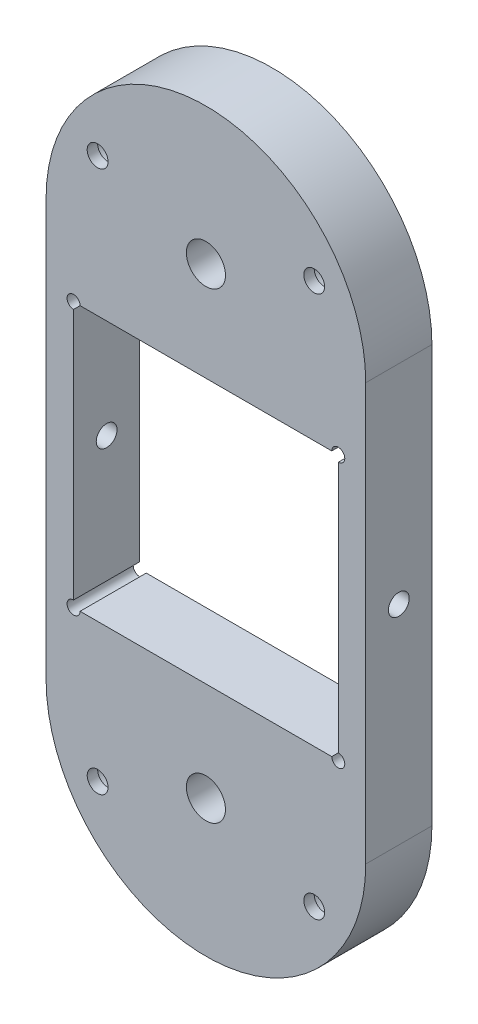
ISO-10303-21;
HEADER;
FILE_DESCRIPTION(('STEP AP214'),'2;1');
FILE_NAME('part.step','',(''),(''),'','','');
FILE_SCHEMA(('AUTOMOTIVE_DESIGN { 1 0 10303 214 1 1 1 1 }'));
ENDSEC;
DATA;
#1=APPLICATION_CONTEXT('core data for automotive mechanical design processes');
#2=APPLICATION_PROTOCOL_DEFINITION('international standard','automotive_design',2000,#1);
#3=PRODUCT_CONTEXT('',#1,'mechanical');
#4=PRODUCT('Part','Part','',(#3));
#5=PRODUCT_RELATED_PRODUCT_CATEGORY('part','',(#4));
#6=PRODUCT_DEFINITION_FORMATION('','',#4);
#7=PRODUCT_DEFINITION_CONTEXT('part definition',#1,'design');
#8=PRODUCT_DEFINITION('design','',#6,#7);
#9=PRODUCT_DEFINITION_SHAPE('','',#8);
#10=(LENGTH_UNIT() NAMED_UNIT(*) SI_UNIT(.MILLI.,.METRE.));
#11=(NAMED_UNIT(*) PLANE_ANGLE_UNIT() SI_UNIT($,.RADIAN.));
#12=(NAMED_UNIT(*) SI_UNIT($,.STERADIAN.) SOLID_ANGLE_UNIT());
#13=UNCERTAINTY_MEASURE_WITH_UNIT(LENGTH_MEASURE(1.E-05),#10,'distance_accuracy_value','');
#14=(GEOMETRIC_REPRESENTATION_CONTEXT(3) GLOBAL_UNCERTAINTY_ASSIGNED_CONTEXT((#13)) GLOBAL_UNIT_ASSIGNED_CONTEXT((#10,
#11,#12)) REPRESENTATION_CONTEXT('',''));
#15=CARTESIAN_POINT('',(0.,0.,0.));
#16=DIRECTION('',(0.,0.,1.));
#17=DIRECTION('',(1.,0.,0.));
#18=AXIS2_PLACEMENT_3D('',#15,#16,#17);
#19=CARTESIAN_POINT('',(0.,44.4,-71.8420489685532));
#20=DIRECTION('',(0.,0.,1.));
#21=DIRECTION('',(1.,0.,0.));
#22=AXIS2_PLACEMENT_3D('',#19,#20,#21);
#23=CYLINDRICAL_SURFACE('',#22,2.5);
#24=CARTESIAN_POINT('',(0.,44.4,0.));
#25=DIRECTION('',(0.,0.,1.));
#26=DIRECTION('',(1.,0.,0.));
#27=AXIS2_PLACEMENT_3D('',#24,#25,#26);
#28=CIRCLE('',#27,2.5);
#29=CARTESIAN_POINT('',(2.5,44.4,0.));
#30=VERTEX_POINT('',#29);
#31=EDGE_CURVE('E361',#30,#30,#28,.F.);
#32=CARTESIAN_POINT('',(0.,44.4,2.));
#33=DIRECTION('',(0.,0.,1.));
#34=DIRECTION('',(1.,0.,0.));
#35=AXIS2_PLACEMENT_3D('',#32,#33,#34);
#36=CIRCLE('',#35,2.5);
#37=CARTESIAN_POINT('',(2.5,44.4,1.99999999999999));
#38=VERTEX_POINT('',#37);
#39=EDGE_CURVE('E51',#38,#38,#36,.F.);
#40=CARTESIAN_POINT('',(2.5,44.4,0.));
#41=CARTESIAN_POINT('',(2.5,44.4,0.0208333333333172));
#42=CARTESIAN_POINT('',(2.5,44.4,0.0416666666666482));
#43=CARTESIAN_POINT('',(2.5,44.4,0.0833333333333149));
#44=CARTESIAN_POINT('',(2.5,44.4,0.104166666666651));
#45=CARTESIAN_POINT('',(2.5,44.4,0.145833333333322));
#46=CARTESIAN_POINT('',(2.5,44.4,0.166666666666658));
#47=CARTESIAN_POINT('',(2.5,44.4,0.208333333333324));
#48=CARTESIAN_POINT('',(2.5,44.4,0.229166666666655));
#49=CARTESIAN_POINT('',(2.5,44.4,0.270833333333317));
#50=CARTESIAN_POINT('',(2.5,44.4,0.291666666666648));
#51=CARTESIAN_POINT('',(2.5,44.4,0.333333333333315));
#52=CARTESIAN_POINT('',(2.5,44.4,0.354166666666651));
#53=CARTESIAN_POINT('',(2.5,44.4,0.395833333333322));
#54=CARTESIAN_POINT('',(2.5,44.4,0.416666666666658));
#55=CARTESIAN_POINT('',(2.5,44.4,0.458333333333324));
#56=CARTESIAN_POINT('',(2.5,44.4,0.479166666666656));
#57=CARTESIAN_POINT('',(2.5,44.4,0.520833333333318));
#58=CARTESIAN_POINT('',(2.5,44.4,0.541666666666649));
#59=CARTESIAN_POINT('',(2.5,44.4,0.583333333333315));
#60=CARTESIAN_POINT('',(2.5,44.4,0.604166666666651));
#61=CARTESIAN_POINT('',(2.5,44.4,0.645833333333322));
#62=CARTESIAN_POINT('',(2.5,44.4,0.666666666666658));
#63=CARTESIAN_POINT('',(2.5,44.4,0.708333333333325));
#64=CARTESIAN_POINT('',(2.5,44.4,0.729166666666656));
#65=CARTESIAN_POINT('',(2.5,44.4,0.770833333333318));
#66=CARTESIAN_POINT('',(2.5,44.4,0.791666666666649));
#67=CARTESIAN_POINT('',(2.5,44.4,0.833333333333316));
#68=CARTESIAN_POINT('',(2.5,44.4,0.854166666666651));
#69=CARTESIAN_POINT('',(2.5,44.4,0.895833333333323));
#70=CARTESIAN_POINT('',(2.5,44.4,0.916666666666658));
#71=CARTESIAN_POINT('',(2.5,44.4,0.958333333333325));
#72=CARTESIAN_POINT('',(2.5,44.4,0.979166666666656));
#73=CARTESIAN_POINT('',(2.5,44.4,1.02083333333332));
#74=CARTESIAN_POINT('',(2.5,44.4,1.04166666666665));
#75=CARTESIAN_POINT('',(2.5,44.4,1.08333333333332));
#76=CARTESIAN_POINT('',(2.5,44.4,1.10416666666665));
#77=CARTESIAN_POINT('',(2.5,44.4,1.14583333333332));
#78=CARTESIAN_POINT('',(2.5,44.4,1.16666666666666));
#79=CARTESIAN_POINT('',(2.5,44.4,1.20833333333333));
#80=CARTESIAN_POINT('',(2.5,44.4,1.22916666666666));
#81=CARTESIAN_POINT('',(2.5,44.4,1.27083333333332));
#82=CARTESIAN_POINT('',(2.5,44.4,1.29166666666665));
#83=CARTESIAN_POINT('',(2.5,44.4,1.33333333333332));
#84=CARTESIAN_POINT('',(2.5,44.4,1.35416666666665));
#85=CARTESIAN_POINT('',(2.5,44.4,1.39583333333332));
#86=CARTESIAN_POINT('',(2.5,44.4,1.41666666666666));
#87=CARTESIAN_POINT('',(2.5,44.4,1.45833333333333));
#88=CARTESIAN_POINT('',(2.5,44.4,1.47916666666666));
#89=CARTESIAN_POINT('',(2.5,44.4,1.52083333333332));
#90=CARTESIAN_POINT('',(2.5,44.4,1.54166666666665));
#91=CARTESIAN_POINT('',(2.5,44.4,1.58333333333332));
#92=CARTESIAN_POINT('',(2.5,44.4,1.60416666666665));
#93=CARTESIAN_POINT('',(2.5,44.4,1.64583333333332));
#94=CARTESIAN_POINT('',(2.5,44.4,1.66666666666666));
#95=CARTESIAN_POINT('',(2.5,44.4,1.70833333333333));
#96=CARTESIAN_POINT('',(2.5,44.4,1.72916666666666));
#97=CARTESIAN_POINT('',(2.5,44.4,1.77083333333332));
#98=CARTESIAN_POINT('',(2.5,44.4,1.79166666666665));
#99=CARTESIAN_POINT('',(2.5,44.4,1.83333333333332));
#100=CARTESIAN_POINT('',(2.5,44.4,1.85416666666665));
#101=CARTESIAN_POINT('',(2.5,44.4,1.89583333333332));
#102=CARTESIAN_POINT('',(2.5,44.4,1.91666666666666));
#103=CARTESIAN_POINT('',(2.5,44.4,1.95833333333333));
#104=CARTESIAN_POINT('',(2.5,44.4,1.97916666666666));
#105=CARTESIAN_POINT('',(2.5,44.4,1.99999999999999));
#106=B_SPLINE_CURVE_WITH_KNOTS('',3,(#40,#41,#42,#43,#44,#45,#46,#47,#48,#49,#50,#51,#52,#53,
#54,#55,#56,#57,#58,#59,#60,#61,#62,#63,#64,#65,#66,#67,#68,#69,#70,#71,#72,#73,#74,#75,#76,#77,
#78,#79,#80,#81,#82,#83,#84,#85,#86,#87,#88,#89,#90,#91,#92,#93,#94,#95,#96,#97,#98,#99,#100,
#101,#102,#103,#104,#105),.UNSPECIFIED.,.F.,.F.,(4,2,2,2,2,2,2,2,2,2,2,2,2,2,2,2,2,2,2,2,2,2,2,
2,2,2,2,2,2,2,2,2,4),(0.,0.0624999999999931,0.125,0.187500000000007,0.25,0.312499999999993,
0.375,0.437500000000007,0.5,0.562499999999994,0.625000000000001,0.687500000000008,
0.750000000000001,0.812499999999994,0.875000000000001,0.937500000000008,1.,1.06249999999999,
1.125,1.18750000000001,1.25,1.31249999999999,1.375,1.43750000000001,1.5,1.56249999999999,1.625,
1.68750000000001,1.75,1.81249999999999,1.875,1.93750000000001,2.),.UNSPECIFIED.);
#107=EDGE_CURVE('BSEAM47',#30,#38,#106,.T.);
#108=ORIENTED_EDGE('',*,*,#31,.T.);
#109=ORIENTED_EDGE('',*,*,#39,.F.);
#110=ORIENTED_EDGE('',*,*,#107,.T.);
#111=ORIENTED_EDGE('',*,*,#107,.F.);
#112=EDGE_LOOP('',(#108,#110,#109,#111));
#113=FACE_BOUND('',#112,.T.);
#114=ADVANCED_FACE('F47',(#113),#23,.F.);
#115=CARTESIAN_POINT('',(0.,-44.4,-71.8420489685532));
#116=DIRECTION('',(0.,0.,1.));
#117=DIRECTION('',(1.,0.,0.));
#118=AXIS2_PLACEMENT_3D('',#115,#116,#117);
#119=CYLINDRICAL_SURFACE('',#118,2.49999999999999);
#120=CARTESIAN_POINT('',(0.,-44.4,0.));
#121=DIRECTION('',(0.,0.,1.));
#122=DIRECTION('',(1.,0.,0.));
#123=AXIS2_PLACEMENT_3D('',#120,#121,#122);
#124=CIRCLE('',#123,2.49999999999999);
#125=CARTESIAN_POINT('',(2.49999999999997,-44.4,0.));
#126=VERTEX_POINT('',#125);
#127=EDGE_CURVE('E360',#126,#126,#124,.F.);
#128=CARTESIAN_POINT('',(0.,-44.4,2.));
#129=DIRECTION('',(0.,0.,1.));
#130=DIRECTION('',(1.,0.,0.));
#131=AXIS2_PLACEMENT_3D('',#128,#129,#130);
#132=CIRCLE('',#131,2.49999999999999);
#133=CARTESIAN_POINT('',(2.49999999999997,-44.4,1.99999999999999));
#134=VERTEX_POINT('',#133);
#135=EDGE_CURVE('E270',#134,#134,#132,.F.);
#136=CARTESIAN_POINT('',(2.49999999999997,-44.4,0.));
#137=CARTESIAN_POINT('',(2.49999999999997,-44.4,0.0208333333333172));
#138=CARTESIAN_POINT('',(2.49999999999997,-44.4,0.0416666666666482));
#139=CARTESIAN_POINT('',(2.49999999999997,-44.4,0.0833333333333149));
#140=CARTESIAN_POINT('',(2.49999999999997,-44.4,0.104166666666651));
#141=CARTESIAN_POINT('',(2.49999999999997,-44.4,0.145833333333322));
#142=CARTESIAN_POINT('',(2.49999999999997,-44.4,0.166666666666658));
#143=CARTESIAN_POINT('',(2.49999999999997,-44.4,0.208333333333324));
#144=CARTESIAN_POINT('',(2.49999999999997,-44.4,0.229166666666655));
#145=CARTESIAN_POINT('',(2.49999999999997,-44.4,0.270833333333317));
#146=CARTESIAN_POINT('',(2.49999999999997,-44.4,0.291666666666648));
#147=CARTESIAN_POINT('',(2.49999999999997,-44.4,0.333333333333315));
#148=CARTESIAN_POINT('',(2.49999999999997,-44.4,0.354166666666651));
#149=CARTESIAN_POINT('',(2.49999999999997,-44.4,0.395833333333322));
#150=CARTESIAN_POINT('',(2.49999999999997,-44.4,0.416666666666658));
#151=CARTESIAN_POINT('',(2.49999999999997,-44.4,0.458333333333324));
#152=CARTESIAN_POINT('',(2.49999999999997,-44.4,0.479166666666656));
#153=CARTESIAN_POINT('',(2.49999999999997,-44.4,0.520833333333318));
#154=CARTESIAN_POINT('',(2.49999999999997,-44.4,0.541666666666649));
#155=CARTESIAN_POINT('',(2.49999999999997,-44.4,0.583333333333315));
#156=CARTESIAN_POINT('',(2.49999999999997,-44.4,0.604166666666651));
#157=CARTESIAN_POINT('',(2.49999999999997,-44.4,0.645833333333322));
#158=CARTESIAN_POINT('',(2.49999999999997,-44.4,0.666666666666658));
#159=CARTESIAN_POINT('',(2.49999999999997,-44.4,0.708333333333325));
#160=CARTESIAN_POINT('',(2.49999999999997,-44.4,0.729166666666656));
#161=CARTESIAN_POINT('',(2.49999999999997,-44.4,0.770833333333318));
#162=CARTESIAN_POINT('',(2.49999999999997,-44.4,0.791666666666649));
#163=CARTESIAN_POINT('',(2.49999999999997,-44.4,0.833333333333316));
#164=CARTESIAN_POINT('',(2.49999999999997,-44.4,0.854166666666651));
#165=CARTESIAN_POINT('',(2.49999999999997,-44.4,0.895833333333323));
#166=CARTESIAN_POINT('',(2.49999999999997,-44.4,0.916666666666658));
#167=CARTESIAN_POINT('',(2.49999999999997,-44.4,0.958333333333325));
#168=CARTESIAN_POINT('',(2.49999999999997,-44.4,0.979166666666656));
#169=CARTESIAN_POINT('',(2.49999999999997,-44.4,1.02083333333332));
#170=CARTESIAN_POINT('',(2.49999999999997,-44.4,1.04166666666665));
#171=CARTESIAN_POINT('',(2.49999999999997,-44.4,1.08333333333332));
#172=CARTESIAN_POINT('',(2.49999999999997,-44.4,1.10416666666665));
#173=CARTESIAN_POINT('',(2.49999999999997,-44.4,1.14583333333332));
#174=CARTESIAN_POINT('',(2.49999999999997,-44.4,1.16666666666666));
#175=CARTESIAN_POINT('',(2.49999999999997,-44.4,1.20833333333333));
#176=CARTESIAN_POINT('',(2.49999999999997,-44.4,1.22916666666666));
#177=CARTESIAN_POINT('',(2.49999999999997,-44.4,1.27083333333332));
#178=CARTESIAN_POINT('',(2.49999999999997,-44.4,1.29166666666665));
#179=CARTESIAN_POINT('',(2.49999999999997,-44.4,1.33333333333332));
#180=CARTESIAN_POINT('',(2.49999999999997,-44.4,1.35416666666665));
#181=CARTESIAN_POINT('',(2.49999999999997,-44.4,1.39583333333332));
#182=CARTESIAN_POINT('',(2.49999999999997,-44.4,1.41666666666666));
#183=CARTESIAN_POINT('',(2.49999999999997,-44.4,1.45833333333333));
#184=CARTESIAN_POINT('',(2.49999999999997,-44.4,1.47916666666666));
#185=CARTESIAN_POINT('',(2.49999999999997,-44.4,1.52083333333332));
#186=CARTESIAN_POINT('',(2.49999999999997,-44.4,1.54166666666665));
#187=CARTESIAN_POINT('',(2.49999999999997,-44.4,1.58333333333332));
#188=CARTESIAN_POINT('',(2.49999999999997,-44.4,1.60416666666665));
#189=CARTESIAN_POINT('',(2.49999999999997,-44.4,1.64583333333332));
#190=CARTESIAN_POINT('',(2.49999999999997,-44.4,1.66666666666666));
#191=CARTESIAN_POINT('',(2.49999999999997,-44.4,1.70833333333333));
#192=CARTESIAN_POINT('',(2.49999999999997,-44.4,1.72916666666666));
#193=CARTESIAN_POINT('',(2.49999999999997,-44.4,1.77083333333332));
#194=CARTESIAN_POINT('',(2.49999999999997,-44.4,1.79166666666665));
#195=CARTESIAN_POINT('',(2.49999999999997,-44.4,1.83333333333332));
#196=CARTESIAN_POINT('',(2.49999999999997,-44.4,1.85416666666665));
#197=CARTESIAN_POINT('',(2.49999999999997,-44.4,1.89583333333332));
#198=CARTESIAN_POINT('',(2.49999999999997,-44.4,1.91666666666666));
#199=CARTESIAN_POINT('',(2.49999999999997,-44.4,1.95833333333333));
#200=CARTESIAN_POINT('',(2.49999999999997,-44.4,1.97916666666666));
#201=CARTESIAN_POINT('',(2.49999999999997,-44.4,1.99999999999999));
#202=B_SPLINE_CURVE_WITH_KNOTS('',3,(#136,#137,#138,#139,#140,#141,#142,#143,#144,#145,#146,
#147,#148,#149,#150,#151,#152,#153,#154,#155,#156,#157,#158,#159,#160,#161,#162,#163,#164,#165,
#166,#167,#168,#169,#170,#171,#172,#173,#174,#175,#176,#177,#178,#179,#180,#181,#182,#183,#184,
#185,#186,#187,#188,#189,#190,#191,#192,#193,#194,#195,#196,#197,#198,#199,#200,#201),
.UNSPECIFIED.,.F.,.F.,(4,2,2,2,2,2,2,2,2,2,2,2,2,2,2,2,2,2,2,2,2,2,2,2,2,2,2,2,2,2,2,2,4),(0.,
0.0624999999999931,0.125,0.187500000000007,0.25,0.312499999999993,0.375,0.437500000000007,0.5,
0.562499999999994,0.625000000000001,0.687500000000008,0.750000000000001,0.812499999999994,
0.875000000000001,0.937500000000008,1.,1.06249999999999,1.125,1.18750000000001,1.25,
1.31249999999999,1.375,1.43750000000001,1.5,1.56249999999999,1.625,1.68750000000001,1.75,
1.81249999999999,1.875,1.93750000000001,2.),.UNSPECIFIED.);
#203=EDGE_CURVE('BSEAM416',#126,#134,#202,.T.);
#204=ORIENTED_EDGE('',*,*,#127,.T.);
#205=ORIENTED_EDGE('',*,*,#135,.F.);
#206=ORIENTED_EDGE('',*,*,#203,.T.);
#207=ORIENTED_EDGE('',*,*,#203,.F.);
#208=EDGE_LOOP('',(#204,#206,#205,#207));
#209=FACE_BOUND('',#208,.T.);
#210=ADVANCED_FACE('F416',(#209),#119,.F.);
#211=CARTESIAN_POINT('',(54.3249997674112,0.,6.35));
#212=DIRECTION('',(-1.,0.,0.));
#213=DIRECTION('',(0.,-1.,0.));
#214=AXIS2_PLACEMENT_3D('',#211,#212,#213);
#215=CYLINDRICAL_SURFACE('',#214,2.);
#216=CARTESIAN_POINT('',(25.4,0.,6.35));
#217=DIRECTION('',(1.,0.,0.));
#218=DIRECTION('',(0.,0.,-1.));
#219=AXIS2_PLACEMENT_3D('',#216,#217,#218);
#220=CIRCLE('',#219,2.);
#221=CARTESIAN_POINT('',(25.4,0.,4.35));
#222=VERTEX_POINT('',#221);
#223=EDGE_CURVE('E173',#222,#222,#220,.F.);
#224=ORIENTED_EDGE('',*,*,#223,.T.);
#225=EDGE_LOOP('',(#224));
#226=FACE_BOUND('',#225,.T.);
#227=CARTESIAN_POINT('',(30.6750002325889,0.,6.35));
#228=DIRECTION('',(-1.,0.,0.));
#229=DIRECTION('',(0.,0.,1.));
#230=AXIS2_PLACEMENT_3D('',#227,#228,#229);
#231=CIRCLE('',#230,2.);
#232=CARTESIAN_POINT('',(30.6750002325889,0.,8.35));
#233=VERTEX_POINT('',#232);
#234=EDGE_CURVE('E185',#233,#233,#231,.T.);
#235=ORIENTED_EDGE('',*,*,#234,.F.);
#236=EDGE_LOOP('',(#235));
#237=FACE_BOUND('',#236,.T.);
#238=ADVANCED_FACE('F423',(#226,#237),#215,.F.);
#239=CARTESIAN_POINT('',(0.,40.,12.7));
#240=DIRECTION('',(0.,0.,1.));
#241=DIRECTION('',(1.,0.,0.));
#242=AXIS2_PLACEMENT_3D('',#239,#240,#241);
#243=PLANE('',#242);
#244=CARTESIAN_POINT('',(0.,44.4,12.7));
#245=DIRECTION('',(0.,0.,1.));
#246=DIRECTION('',(1.,0.,0.));
#247=AXIS2_PLACEMENT_3D('',#244,#245,#246);
#248=CIRCLE('',#247,3.75);
#249=CARTESIAN_POINT('',(3.75,44.4,12.7));
#250=VERTEX_POINT('',#249);
#251=EDGE_CURVE('E281',#250,#250,#248,.T.);
#252=ORIENTED_EDGE('',*,*,#251,.F.);
#253=EDGE_LOOP('',(#252));
#254=FACE_BOUND('',#253,.T.);
#255=CARTESIAN_POINT('',(0.,-44.4,12.7));
#256=DIRECTION('',(0.,0.,1.));
#257=DIRECTION('',(-1.,0.,0.));
#258=AXIS2_PLACEMENT_3D('',#255,#256,#257);
#259=CIRCLE('',#258,3.74999999999999);
#260=CARTESIAN_POINT('',(-3.75000000000002,-44.4,12.7));
#261=VERTEX_POINT('',#260);
#262=EDGE_CURVE('E287',#261,#261,#259,.T.);
#263=ORIENTED_EDGE('',*,*,#262,.F.);
#264=EDGE_LOOP('',(#263));
#265=FACE_BOUND('',#264,.T.);
#266=CARTESIAN_POINT('',(25.4,-25.4,12.7));
#267=DIRECTION('',(0.,0.,1.));
#268=DIRECTION('',(1.,0.,0.));
#269=AXIS2_PLACEMENT_3D('',#266,#267,#268);
#270=CIRCLE('',#269,1.25);
#271=CARTESIAN_POINT('',(25.4,-24.15,12.7));
#272=VERTEX_POINT('',#271);
#273=CARTESIAN_POINT('',(24.15,-25.4,12.7));
#274=VERTEX_POINT('',#273);
#275=EDGE_CURVE('E269',#272,#274,#270,.F.);
#276=ORIENTED_EDGE('',*,*,#275,.T.);
#277=DIRECTION('',(1.,0.,0.));
#278=VECTOR('',#277,1.);
#279=CARTESIAN_POINT('',(-25.4,-25.4,12.7));
#280=LINE('',#279,#278);
#281=CARTESIAN_POINT('',(-24.15,-25.4,12.7));
#282=VERTEX_POINT('',#281);
#283=EDGE_CURVE('E179',#282,#274,#280,.T.);
#284=ORIENTED_EDGE('',*,*,#283,.F.);
#285=CARTESIAN_POINT('',(-25.4,-25.4,12.7));
#286=DIRECTION('',(0.,0.,1.));
#287=DIRECTION('',(1.,0.,0.));
#288=AXIS2_PLACEMENT_3D('',#285,#286,#287);
#289=CIRCLE('',#288,1.25);
#290=CARTESIAN_POINT('',(-25.4,-24.15,12.7));
#291=VERTEX_POINT('',#290);
#292=EDGE_CURVE('E65',#282,#291,#289,.F.);
#293=ORIENTED_EDGE('',*,*,#292,.T.);
#294=DIRECTION('',(0.,-1.,0.));
#295=VECTOR('',#294,1.);
#296=CARTESIAN_POINT('',(-25.4,-25.4,12.7));
#297=LINE('',#296,#295);
#298=CARTESIAN_POINT('',(-25.4,24.15,12.7));
#299=VERTEX_POINT('',#298);
#300=EDGE_CURVE('E381',#299,#291,#297,.T.);
#301=ORIENTED_EDGE('',*,*,#300,.F.);
#302=CARTESIAN_POINT('',(-25.4,25.4,12.7));
#303=DIRECTION('',(0.,0.,1.));
#304=DIRECTION('',(1.,0.,0.));
#305=AXIS2_PLACEMENT_3D('',#302,#303,#304);
#306=CIRCLE('',#305,1.25);
#307=CARTESIAN_POINT('',(-24.15,25.4,12.7));
#308=VERTEX_POINT('',#307);
#309=EDGE_CURVE('E327',#299,#308,#306,.F.);
#310=ORIENTED_EDGE('',*,*,#309,.T.);
#311=DIRECTION('',(-1.,0.,0.));
#312=VECTOR('',#311,1.);
#313=CARTESIAN_POINT('',(-25.4,25.4,12.7));
#314=LINE('',#313,#312);
#315=CARTESIAN_POINT('',(24.15,25.4,12.7));
#316=VERTEX_POINT('',#315);
#317=EDGE_CURVE('E379',#316,#308,#314,.T.);
#318=ORIENTED_EDGE('',*,*,#317,.F.);
#319=CARTESIAN_POINT('',(25.4,25.4,12.7));
#320=DIRECTION('',(0.,0.,1.));
#321=DIRECTION('',(1.,0.,0.));
#322=AXIS2_PLACEMENT_3D('',#319,#320,#321);
#323=CIRCLE('',#322,1.25);
#324=CARTESIAN_POINT('',(25.4,24.15,12.7));
#325=VERTEX_POINT('',#324);
#326=EDGE_CURVE('E143',#316,#325,#323,.F.);
#327=ORIENTED_EDGE('',*,*,#326,.T.);
#328=DIRECTION('',(0.,1.,0.));
#329=VECTOR('',#328,1.);
#330=CARTESIAN_POINT('',(25.4,-25.4,12.7));
#331=LINE('',#330,#329);
#332=EDGE_CURVE('E365',#272,#325,#331,.T.);
#333=ORIENTED_EDGE('',*,*,#332,.F.);
#334=EDGE_LOOP('',(#276,#284,#293,#301,#310,#318,#327,#333));
#335=FACE_BOUND('',#334,.T.);
#336=CARTESIAN_POINT('',(0.,40.,12.7));
#337=DIRECTION('',(0.,0.,1.));
#338=DIRECTION('',(1.,0.,0.));
#339=AXIS2_PLACEMENT_3D('',#336,#337,#338);
#340=CIRCLE('',#339,30.6750002325888);
#341=CARTESIAN_POINT('',(30.6750002325889,40.,12.7));
#342=VERTEX_POINT('',#341);
#343=CARTESIAN_POINT('',(-30.6750002325888,40.,12.7));
#344=VERTEX_POINT('',#343);
#345=EDGE_CURVE('E203',#342,#344,#340,.T.);
#346=ORIENTED_EDGE('',*,*,#345,.T.);
#347=DIRECTION('',(0.,-1.,0.));
#348=VECTOR('',#347,1.);
#349=CARTESIAN_POINT('',(-30.6750002325888,-40.,12.7));
#350=LINE('',#349,#348);
#351=CARTESIAN_POINT('',(-30.6750002325888,-40.,12.7));
#352=VERTEX_POINT('',#351);
#353=EDGE_CURVE('E207',#344,#352,#350,.T.);
#354=ORIENTED_EDGE('',*,*,#353,.T.);
#355=CARTESIAN_POINT('',(0.,-40.,12.7));
#356=DIRECTION('',(0.,0.,1.));
#357=DIRECTION('',(1.,0.,0.));
#358=AXIS2_PLACEMENT_3D('',#355,#356,#357);
#359=CIRCLE('',#358,30.6750002325888);
#360=CARTESIAN_POINT('',(30.6750002325889,-40.,12.7));
#361=VERTEX_POINT('',#360);
#362=EDGE_CURVE('E211',#352,#361,#359,.T.);
#363=ORIENTED_EDGE('',*,*,#362,.T.);
#364=DIRECTION('',(0.,1.,0.));
#365=VECTOR('',#364,1.);
#366=CARTESIAN_POINT('',(30.6750002325889,40.,12.7));
#367=LINE('',#366,#365);
#368=EDGE_CURVE('E214',#361,#342,#367,.T.);
#369=ORIENTED_EDGE('',*,*,#368,.T.);
#370=EDGE_LOOP('',(#346,#354,#363,#369));
#371=FACE_BOUND('',#370,.T.);
#372=CARTESIAN_POINT('',(-20.7846096908265,-52.,12.7));
#373=DIRECTION('',(0.,0.,1.));
#374=DIRECTION('',(-1.,0.,0.));
#375=AXIS2_PLACEMENT_3D('',#372,#373,#374);
#376=CIRCLE('',#375,2.00000000000001);
#377=CARTESIAN_POINT('',(-22.7846096908265,-52.,12.7));
#378=VERTEX_POINT('',#377);
#379=EDGE_CURVE('E198',#378,#378,#376,.T.);
#380=ORIENTED_EDGE('',*,*,#379,.F.);
#381=EDGE_LOOP('',(#380));
#382=FACE_BOUND('',#381,.T.);
#383=CARTESIAN_POINT('',(20.7846096908265,-52.,12.7));
#384=DIRECTION('',(0.,0.,1.));
#385=DIRECTION('',(-1.,0.,0.));
#386=AXIS2_PLACEMENT_3D('',#383,#384,#385);
#387=CIRCLE('',#386,2.);
#388=CARTESIAN_POINT('',(18.7846096908265,-52.,12.7));
#389=VERTEX_POINT('',#388);
#390=EDGE_CURVE('E186',#389,#389,#387,.T.);
#391=ORIENTED_EDGE('',*,*,#390,.F.);
#392=EDGE_LOOP('',(#391));
#393=FACE_BOUND('',#392,.T.);
#394=CARTESIAN_POINT('',(20.7846096908265,52.,12.7));
#395=DIRECTION('',(0.,0.,1.));
#396=DIRECTION('',(1.,0.,0.));
#397=AXIS2_PLACEMENT_3D('',#394,#395,#396);
#398=CIRCLE('',#397,2.);
#399=CARTESIAN_POINT('',(22.7846096908265,52.,12.7));
#400=VERTEX_POINT('',#399);
#401=EDGE_CURVE('E194',#400,#400,#398,.T.);
#402=ORIENTED_EDGE('',*,*,#401,.F.);
#403=EDGE_LOOP('',(#402));
#404=FACE_BOUND('',#403,.T.);
#405=CARTESIAN_POINT('',(-20.7846096908265,52.,12.7));
#406=DIRECTION('',(0.,0.,1.));
#407=DIRECTION('',(1.,0.,0.));
#408=AXIS2_PLACEMENT_3D('',#405,#406,#407);
#409=CIRCLE('',#408,2.00000000000001);
#410=CARTESIAN_POINT('',(-18.7846096908265,52.,12.7));
#411=VERTEX_POINT('',#410);
#412=EDGE_CURVE('E190',#411,#411,#409,.T.);
#413=ORIENTED_EDGE('',*,*,#412,.F.);
#414=EDGE_LOOP('',(#413));
#415=FACE_BOUND('',#414,.T.);
#416=ADVANCED_FACE('F392',(#254,#265,#335,#371,#382,#393,#404,#415),#243,.T.);
#417=CARTESIAN_POINT('',(0.,40.,0.));
#418=DIRECTION('',(0.,0.,1.));
#419=DIRECTION('',(1.,0.,0.));
#420=AXIS2_PLACEMENT_3D('',#417,#418,#419);
#421=PLANE('',#420);
#422=CARTESIAN_POINT('',(20.7846096908265,-52.,0.));
#423=DIRECTION('',(0.,0.,-1.));
#424=DIRECTION('',(1.,0.,0.));
#425=AXIS2_PLACEMENT_3D('',#422,#423,#424);
#426=CIRCLE('',#425,3.75);
#427=CARTESIAN_POINT('',(24.5346096908265,-52.,0.));
#428=VERTEX_POINT('',#427);
#429=EDGE_CURVE('E311',#428,#428,#426,.T.);
#430=ORIENTED_EDGE('',*,*,#429,.F.);
#431=EDGE_LOOP('',(#430));
#432=FACE_BOUND('',#431,.T.);
#433=CARTESIAN_POINT('',(-20.7846096908265,-52.,0.));
#434=DIRECTION('',(0.,0.,-1.));
#435=DIRECTION('',(-1.,0.,0.));
#436=AXIS2_PLACEMENT_3D('',#433,#434,#435);
#437=CIRCLE('',#436,3.75);
#438=CARTESIAN_POINT('',(-24.5346096908265,-52.,0.));
#439=VERTEX_POINT('',#438);
#440=EDGE_CURVE('E302',#439,#439,#437,.T.);
#441=ORIENTED_EDGE('',*,*,#440,.F.);
#442=EDGE_LOOP('',(#441));
#443=FACE_BOUND('',#442,.T.);
#444=CARTESIAN_POINT('',(-20.7846096908265,52.,0.));
#445=DIRECTION('',(0.,0.,-1.));
#446=DIRECTION('',(1.,0.,0.));
#447=AXIS2_PLACEMENT_3D('',#444,#445,#446);
#448=CIRCLE('',#447,3.75);
#449=CARTESIAN_POINT('',(-17.0346096908265,52.,0.));
#450=VERTEX_POINT('',#449);
#451=EDGE_CURVE('E301',#450,#450,#448,.T.);
#452=ORIENTED_EDGE('',*,*,#451,.F.);
#453=EDGE_LOOP('',(#452));
#454=FACE_BOUND('',#453,.T.);
#455=CARTESIAN_POINT('',(20.7846096908265,52.,0.));
#456=DIRECTION('',(0.,0.,-1.));
#457=DIRECTION('',(-1.,0.,0.));
#458=AXIS2_PLACEMENT_3D('',#455,#456,#457);
#459=CIRCLE('',#458,3.75);
#460=CARTESIAN_POINT('',(17.0346096908265,52.,0.));
#461=VERTEX_POINT('',#460);
#462=EDGE_CURVE('E306',#461,#461,#459,.T.);
#463=ORIENTED_EDGE('',*,*,#462,.F.);
#464=EDGE_LOOP('',(#463));
#465=FACE_BOUND('',#464,.T.);
#466=ORIENTED_EDGE('',*,*,#127,.F.);
#467=EDGE_LOOP('',(#466));
#468=FACE_BOUND('',#467,.T.);
#469=ORIENTED_EDGE('',*,*,#31,.F.);
#470=EDGE_LOOP('',(#469));
#471=FACE_BOUND('',#470,.T.);
#472=DIRECTION('',(-1.,0.,0.));
#473=VECTOR('',#472,1.);
#474=CARTESIAN_POINT('',(-25.4,-25.4,0.));
#475=LINE('',#474,#473);
#476=CARTESIAN_POINT('',(24.15,-25.4,0.));
#477=VERTEX_POINT('',#476);
#478=CARTESIAN_POINT('',(-24.15,-25.4,0.));
#479=VERTEX_POINT('',#478);
#480=EDGE_CURVE('E175',#477,#479,#475,.T.);
#481=ORIENTED_EDGE('',*,*,#480,.F.);
#482=CARTESIAN_POINT('',(25.4,-25.4,0.));
#483=DIRECTION('',(0.,0.,-1.));
#484=DIRECTION('',(1.,0.,0.));
#485=AXIS2_PLACEMENT_3D('',#482,#483,#484);
#486=CIRCLE('',#485,1.25);
#487=CARTESIAN_POINT('',(25.4,-24.15,0.));
#488=VERTEX_POINT('',#487);
#489=EDGE_CURVE('E73',#488,#477,#486,.T.);
#490=ORIENTED_EDGE('',*,*,#489,.F.);
#491=DIRECTION('',(0.,-1.,0.));
#492=VECTOR('',#491,1.);
#493=CARTESIAN_POINT('',(25.4,-25.4,0.));
#494=LINE('',#493,#492);
#495=CARTESIAN_POINT('',(25.4,24.15,0.));
#496=VERTEX_POINT('',#495);
#497=EDGE_CURVE('E161',#496,#488,#494,.T.);
#498=ORIENTED_EDGE('',*,*,#497,.F.);
#499=CARTESIAN_POINT('',(25.4,25.4,0.));
#500=DIRECTION('',(0.,0.,-1.));
#501=DIRECTION('',(-1.,0.,0.));
#502=AXIS2_PLACEMENT_3D('',#499,#500,#501);
#503=CIRCLE('',#502,1.25);
#504=CARTESIAN_POINT('',(24.15,25.4,0.));
#505=VERTEX_POINT('',#504);
#506=EDGE_CURVE('E140',#505,#496,#503,.T.);
#507=ORIENTED_EDGE('',*,*,#506,.F.);
#508=DIRECTION('',(1.,0.,0.));
#509=VECTOR('',#508,1.);
#510=CARTESIAN_POINT('',(-25.4,25.4,0.));
#511=LINE('',#510,#509);
#512=CARTESIAN_POINT('',(-24.15,25.4,0.));
#513=VERTEX_POINT('',#512);
#514=EDGE_CURVE('E159',#513,#505,#511,.T.);
#515=ORIENTED_EDGE('',*,*,#514,.F.);
#516=CARTESIAN_POINT('',(-25.4,25.4,0.));
#517=DIRECTION('',(0.,0.,-1.));
#518=DIRECTION('',(1.,0.,0.));
#519=AXIS2_PLACEMENT_3D('',#516,#517,#518);
#520=CIRCLE('',#519,1.25);
#521=CARTESIAN_POINT('',(-25.4,24.15,0.));
#522=VERTEX_POINT('',#521);
#523=EDGE_CURVE('E163',#522,#513,#520,.T.);
#524=ORIENTED_EDGE('',*,*,#523,.F.);
#525=DIRECTION('',(0.,1.,0.));
#526=VECTOR('',#525,1.);
#527=CARTESIAN_POINT('',(-25.4,-25.4,0.));
#528=LINE('',#527,#526);
#529=CARTESIAN_POINT('',(-25.4,-24.15,0.));
#530=VERTEX_POINT('',#529);
#531=EDGE_CURVE('E369',#530,#522,#528,.T.);
#532=ORIENTED_EDGE('',*,*,#531,.F.);
#533=CARTESIAN_POINT('',(-25.4,-25.4,0.));
#534=DIRECTION('',(0.,0.,-1.));
#535=DIRECTION('',(-1.,0.,0.));
#536=AXIS2_PLACEMENT_3D('',#533,#534,#535);
#537=CIRCLE('',#536,1.25);
#538=EDGE_CURVE('E331',#479,#530,#537,.T.);
#539=ORIENTED_EDGE('',*,*,#538,.F.);
#540=EDGE_LOOP('',(#481,#490,#498,#507,#515,#524,#532,#539));
#541=FACE_BOUND('',#540,.T.);
#542=CARTESIAN_POINT('',(0.,40.,0.));
#543=DIRECTION('',(0.,0.,1.));
#544=DIRECTION('',(1.,0.,0.));
#545=AXIS2_PLACEMENT_3D('',#542,#543,#544);
#546=CIRCLE('',#545,30.6750002325888);
#547=CARTESIAN_POINT('',(30.6750002325889,40.,0.));
#548=VERTEX_POINT('',#547);
#549=CARTESIAN_POINT('',(-30.6750002325888,40.,0.));
#550=VERTEX_POINT('',#549);
#551=EDGE_CURVE('E202',#548,#550,#546,.T.);
#552=ORIENTED_EDGE('',*,*,#551,.F.);
#553=DIRECTION('',(0.,1.,0.));
#554=VECTOR('',#553,1.);
#555=CARTESIAN_POINT('',(30.6750002325889,40.,0.));
#556=LINE('',#555,#554);
#557=CARTESIAN_POINT('',(30.6750002325889,-40.,0.));
#558=VERTEX_POINT('',#557);
#559=EDGE_CURVE('E208',#558,#548,#556,.T.);
#560=ORIENTED_EDGE('',*,*,#559,.F.);
#561=CARTESIAN_POINT('',(0.,-40.,0.));
#562=DIRECTION('',(0.,0.,1.));
#563=DIRECTION('',(1.,0.,0.));
#564=AXIS2_PLACEMENT_3D('',#561,#562,#563);
#565=CIRCLE('',#564,30.6750002325888);
#566=CARTESIAN_POINT('',(-30.6750002325888,-40.,0.));
#567=VERTEX_POINT('',#566);
#568=EDGE_CURVE('E224',#567,#558,#565,.T.);
#569=ORIENTED_EDGE('',*,*,#568,.F.);
#570=DIRECTION('',(0.,-1.,0.));
#571=VECTOR('',#570,1.);
#572=CARTESIAN_POINT('',(-30.6750002325888,-40.,0.));
#573=LINE('',#572,#571);
#574=EDGE_CURVE('E221',#550,#567,#573,.T.);
#575=ORIENTED_EDGE('',*,*,#574,.F.);
#576=EDGE_LOOP('',(#552,#560,#569,#575));
#577=FACE_BOUND('',#576,.T.);
#578=ADVANCED_FACE('F156',(#432,#443,#454,#465,#468,#471,#541,#577),#421,.F.);
#579=CARTESIAN_POINT('',(0.,40.,12.7));
#580=DIRECTION('',(0.,0.,-1.));
#581=DIRECTION('',(-1.,0.,0.));
#582=AXIS2_PLACEMENT_3D('',#579,#580,#581);
#583=CYLINDRICAL_SURFACE('',#582,30.6750002325888);
#584=ORIENTED_EDGE('',*,*,#551,.T.);
#585=DIRECTION('',(0.,0.,-1.));
#586=VECTOR('',#585,1.);
#587=CARTESIAN_POINT('',(-30.6750002325888,40.,12.7));
#588=LINE('',#587,#586);
#589=EDGE_CURVE('E150',#344,#550,#588,.T.);
#590=ORIENTED_EDGE('',*,*,#589,.F.);
#591=ORIENTED_EDGE('',*,*,#345,.F.);
#592=DIRECTION('',(0.,0.,-1.));
#593=VECTOR('',#592,1.);
#594=CARTESIAN_POINT('',(30.6750002325889,40.,12.7));
#595=LINE('',#594,#593);
#596=EDGE_CURVE('E217',#342,#548,#595,.T.);
#597=ORIENTED_EDGE('',*,*,#596,.T.);
#598=EDGE_LOOP('',(#584,#590,#591,#597));
#599=FACE_BOUND('',#598,.T.);
#600=ADVANCED_FACE('F49',(#599),#583,.T.);
#601=CARTESIAN_POINT('',(-30.6750002325888,-40.,12.7));
#602=DIRECTION('',(1.,0.,0.));
#603=DIRECTION('',(0.,0.,-1.));
#604=AXIS2_PLACEMENT_3D('',#601,#602,#603);
#605=PLANE('',#604);
#606=CARTESIAN_POINT('',(-30.6750002325888,0.,6.35));
#607=DIRECTION('',(-1.,0.,0.));
#608=DIRECTION('',(0.,-1.,0.));
#609=AXIS2_PLACEMENT_3D('',#606,#607,#608);
#610=CIRCLE('',#609,2.);
#611=CARTESIAN_POINT('',(-30.6750002325888,-2.,6.35));
#612=VERTEX_POINT('',#611);
#613=EDGE_CURVE('E181',#612,#612,#610,.T.);
#614=ORIENTED_EDGE('',*,*,#613,.F.);
#615=EDGE_LOOP('',(#614));
#616=FACE_BOUND('',#615,.T.);
#617=ORIENTED_EDGE('',*,*,#574,.T.);
#618=DIRECTION('',(0.,0.,-1.));
#619=VECTOR('',#618,1.);
#620=CARTESIAN_POINT('',(-30.6750002325888,-40.,12.7));
#621=LINE('',#620,#619);
#622=EDGE_CURVE('E236',#352,#567,#621,.T.);
#623=ORIENTED_EDGE('',*,*,#622,.F.);
#624=ORIENTED_EDGE('',*,*,#353,.F.);
#625=ORIENTED_EDGE('',*,*,#589,.T.);
#626=EDGE_LOOP('',(#617,#623,#624,#625));
#627=FACE_BOUND('',#626,.T.);
#628=ADVANCED_FACE('F469',(#616,#627),#605,.F.);
#629=CARTESIAN_POINT('',(0.,-40.,12.7));
#630=DIRECTION('',(0.,0.,-1.));
#631=DIRECTION('',(-1.,0.,0.));
#632=AXIS2_PLACEMENT_3D('',#629,#630,#631);
#633=CYLINDRICAL_SURFACE('',#632,30.6750002325888);
#634=ORIENTED_EDGE('',*,*,#568,.T.);
#635=DIRECTION('',(0.,0.,-1.));
#636=VECTOR('',#635,1.);
#637=CARTESIAN_POINT('',(30.6750002325889,-40.,12.7));
#638=LINE('',#637,#636);
#639=EDGE_CURVE('E232',#361,#558,#638,.T.);
#640=ORIENTED_EDGE('',*,*,#639,.F.);
#641=ORIENTED_EDGE('',*,*,#362,.F.);
#642=ORIENTED_EDGE('',*,*,#622,.T.);
#643=EDGE_LOOP('',(#634,#640,#641,#642));
#644=FACE_BOUND('',#643,.T.);
#645=ADVANCED_FACE('F466',(#644),#633,.T.);
#646=CARTESIAN_POINT('',(30.6750002325889,40.,12.7));
#647=DIRECTION('',(-1.,0.,0.));
#648=DIRECTION('',(0.,0.,1.));
#649=AXIS2_PLACEMENT_3D('',#646,#647,#648);
#650=PLANE('',#649);
#651=ORIENTED_EDGE('',*,*,#234,.T.);
#652=EDGE_LOOP('',(#651));
#653=FACE_BOUND('',#652,.T.);
#654=ORIENTED_EDGE('',*,*,#559,.T.);
#655=ORIENTED_EDGE('',*,*,#596,.F.);
#656=ORIENTED_EDGE('',*,*,#368,.F.);
#657=ORIENTED_EDGE('',*,*,#639,.T.);
#658=EDGE_LOOP('',(#654,#655,#656,#657));
#659=FACE_BOUND('',#658,.T.);
#660=ADVANCED_FACE('F446',(#653,#659),#650,.F.);
#661=CARTESIAN_POINT('',(20.7846096908265,-52.,-154.089730964081));
#662=DIRECTION('',(0.,0.,1.));
#663=DIRECTION('',(1.,0.,0.));
#664=AXIS2_PLACEMENT_3D('',#661,#662,#663);
#665=CYLINDRICAL_SURFACE('',#664,2.);
#666=CARTESIAN_POINT('',(20.7846096908265,-52.,10.7));
#667=DIRECTION('',(0.,0.,1.));
#668=DIRECTION('',(1.,0.,0.));
#669=AXIS2_PLACEMENT_3D('',#666,#667,#668);
#670=CIRCLE('',#669,2.);
#671=CARTESIAN_POINT('',(22.7846096908265,-52.,10.7));
#672=VERTEX_POINT('',#671);
#673=EDGE_CURVE('E266',#672,#672,#670,.F.);
#674=ORIENTED_EDGE('',*,*,#673,.T.);
#675=EDGE_LOOP('',(#674));
#676=FACE_BOUND('',#675,.T.);
#677=ORIENTED_EDGE('',*,*,#390,.T.);
#678=EDGE_LOOP('',(#677));
#679=FACE_BOUND('',#678,.T.);
#680=ADVANCED_FACE('F442',(#676,#679),#665,.F.);
#681=CARTESIAN_POINT('',(-20.7846096908265,-52.,-154.089730964081));
#682=DIRECTION('',(0.,0.,1.));
#683=DIRECTION('',(1.,0.,0.));
#684=AXIS2_PLACEMENT_3D('',#681,#682,#683);
#685=CYLINDRICAL_SURFACE('',#684,2.00000000000001);
#686=CARTESIAN_POINT('',(-20.7846096908265,-52.,10.7));
#687=DIRECTION('',(0.,0.,1.));
#688=DIRECTION('',(1.,0.,0.));
#689=AXIS2_PLACEMENT_3D('',#686,#687,#688);
#690=CIRCLE('',#689,2.00000000000001);
#691=CARTESIAN_POINT('',(-18.7846096908265,-52.,10.7));
#692=VERTEX_POINT('',#691);
#693=EDGE_CURVE('E262',#692,#692,#690,.F.);
#694=ORIENTED_EDGE('',*,*,#693,.T.);
#695=EDGE_LOOP('',(#694));
#696=FACE_BOUND('',#695,.T.);
#697=ORIENTED_EDGE('',*,*,#379,.T.);
#698=EDGE_LOOP('',(#697));
#699=FACE_BOUND('',#698,.T.);
#700=ADVANCED_FACE('F445',(#696,#699),#685,.F.);
#701=CARTESIAN_POINT('',(20.7846096908265,52.,-154.089730964081));
#702=DIRECTION('',(0.,0.,1.));
#703=DIRECTION('',(1.,0.,0.));
#704=AXIS2_PLACEMENT_3D('',#701,#702,#703);
#705=CYLINDRICAL_SURFACE('',#704,2.);
#706=CARTESIAN_POINT('',(20.7846096908265,52.,10.7));
#707=DIRECTION('',(0.,0.,1.));
#708=DIRECTION('',(1.,0.,0.));
#709=AXIS2_PLACEMENT_3D('',#706,#707,#708);
#710=CIRCLE('',#709,2.);
#711=CARTESIAN_POINT('',(22.7846096908265,52.,10.7));
#712=VERTEX_POINT('',#711);
#713=EDGE_CURVE('E257',#712,#712,#710,.F.);
#714=ORIENTED_EDGE('',*,*,#713,.T.);
#715=EDGE_LOOP('',(#714));
#716=FACE_BOUND('',#715,.T.);
#717=ORIENTED_EDGE('',*,*,#401,.T.);
#718=EDGE_LOOP('',(#717));
#719=FACE_BOUND('',#718,.T.);
#720=ADVANCED_FACE('F450',(#716,#719),#705,.F.);
#721=CARTESIAN_POINT('',(-20.7846096908265,52.,-154.089730964081));
#722=DIRECTION('',(0.,0.,1.));
#723=DIRECTION('',(1.,0.,0.));
#724=AXIS2_PLACEMENT_3D('',#721,#722,#723);
#725=CYLINDRICAL_SURFACE('',#724,2.00000000000001);
#726=CARTESIAN_POINT('',(-20.7846096908265,52.,10.7));
#727=DIRECTION('',(0.,0.,1.));
#728=DIRECTION('',(1.,0.,0.));
#729=AXIS2_PLACEMENT_3D('',#726,#727,#728);
#730=CIRCLE('',#729,2.00000000000001);
#731=CARTESIAN_POINT('',(-18.7846096908265,52.,10.7));
#732=VERTEX_POINT('',#731);
#733=EDGE_CURVE('E253',#732,#732,#730,.F.);
#734=ORIENTED_EDGE('',*,*,#733,.T.);
#735=EDGE_LOOP('',(#734));
#736=FACE_BOUND('',#735,.T.);
#737=ORIENTED_EDGE('',*,*,#412,.T.);
#738=EDGE_LOOP('',(#737));
#739=FACE_BOUND('',#738,.T.);
#740=ADVANCED_FACE('F440',(#736,#739),#725,.F.);
#741=CARTESIAN_POINT('',(-25.4,0.,6.35));
#742=DIRECTION('',(-1.,0.,0.));
#743=DIRECTION('',(0.,0.,1.));
#744=AXIS2_PLACEMENT_3D('',#741,#742,#743);
#745=CIRCLE('',#744,2.);
#746=CARTESIAN_POINT('',(-25.4,0.,8.35));
#747=VERTEX_POINT('',#746);
#748=EDGE_CURVE('E168',#747,#747,#745,.F.);
#749=ORIENTED_EDGE('',*,*,#748,.T.);
#750=EDGE_LOOP('',(#749));
#751=FACE_BOUND('',#750,.T.);
#752=ORIENTED_EDGE('',*,*,#613,.T.);
#753=EDGE_LOOP('',(#752));
#754=FACE_BOUND('',#753,.T.);
#755=ADVANCED_FACE('F437',(#751,#754),#215,.F.);
#756=CARTESIAN_POINT('',(25.4,-25.4,-71.8420489685532));
#757=DIRECTION('',(1.,0.,0.));
#758=DIRECTION('',(0.,0.,-1.));
#759=AXIS2_PLACEMENT_3D('',#756,#757,#758);
#760=PLANE('',#759);
#761=ORIENTED_EDGE('',*,*,#497,.T.);
#762=DIRECTION('',(0.,0.,-1.));
#763=VECTOR('',#762,1.);
#764=CARTESIAN_POINT('',(25.4,-24.15,16.2355339059327));
#765=LINE('',#764,#763);
#766=EDGE_CURVE('E356',#488,#272,#765,.F.);
#767=ORIENTED_EDGE('',*,*,#766,.T.);
#768=ORIENTED_EDGE('',*,*,#332,.T.);
#769=DIRECTION('',(0.,0.,-1.));
#770=VECTOR('',#769,1.);
#771=CARTESIAN_POINT('',(25.4,24.15,16.2355339059327));
#772=LINE('',#771,#770);
#773=EDGE_CURVE('E345',#325,#496,#772,.T.);
#774=ORIENTED_EDGE('',*,*,#773,.T.);
#775=EDGE_LOOP('',(#761,#767,#768,#774));
#776=FACE_BOUND('',#775,.T.);
#777=ORIENTED_EDGE('',*,*,#223,.F.);
#778=EDGE_LOOP('',(#777));
#779=FACE_BOUND('',#778,.T.);
#780=ADVANCED_FACE('F397',(#776,#779),#760,.F.);
#781=CARTESIAN_POINT('',(-25.4,-25.4,-71.8420489685532));
#782=DIRECTION('',(-1.,0.,0.));
#783=DIRECTION('',(0.,0.,1.));
#784=AXIS2_PLACEMENT_3D('',#781,#782,#783);
#785=PLANE('',#784);
#786=ORIENTED_EDGE('',*,*,#300,.T.);
#787=DIRECTION('',(0.,0.,-1.));
#788=VECTOR('',#787,1.);
#789=CARTESIAN_POINT('',(-25.4,-24.15,16.2355339059327));
#790=LINE('',#789,#788);
#791=EDGE_CURVE('E352',#291,#530,#790,.T.);
#792=ORIENTED_EDGE('',*,*,#791,.T.);
#793=ORIENTED_EDGE('',*,*,#531,.T.);
#794=DIRECTION('',(0.,0.,-1.));
#795=VECTOR('',#794,1.);
#796=CARTESIAN_POINT('',(-25.4,24.15,16.2355339059327));
#797=LINE('',#796,#795);
#798=EDGE_CURVE('E348',#522,#299,#797,.F.);
#799=ORIENTED_EDGE('',*,*,#798,.T.);
#800=EDGE_LOOP('',(#786,#792,#793,#799));
#801=FACE_BOUND('',#800,.T.);
#802=ORIENTED_EDGE('',*,*,#748,.F.);
#803=EDGE_LOOP('',(#802));
#804=FACE_BOUND('',#803,.T.);
#805=ADVANCED_FACE('F401',(#801,#804),#785,.F.);
#806=CARTESIAN_POINT('',(-25.4,-25.4,-71.8420489685532));
#807=DIRECTION('',(0.,-1.,0.));
#808=DIRECTION('',(0.,0.,-1.));
#809=AXIS2_PLACEMENT_3D('',#806,#807,#808);
#810=PLANE('',#809);
#811=ORIENTED_EDGE('',*,*,#283,.T.);
#812=DIRECTION('',(0.,0.,-1.));
#813=VECTOR('',#812,1.);
#814=CARTESIAN_POINT('',(24.15,-25.4,16.2355339059327));
#815=LINE('',#814,#813);
#816=EDGE_CURVE('E12',#274,#477,#815,.T.);
#817=ORIENTED_EDGE('',*,*,#816,.T.);
#818=ORIENTED_EDGE('',*,*,#480,.T.);
#819=DIRECTION('',(0.,0.,-1.));
#820=VECTOR('',#819,1.);
#821=CARTESIAN_POINT('',(-24.15,-25.4,16.2355339059327));
#822=LINE('',#821,#820);
#823=EDGE_CURVE('E57',#479,#282,#822,.F.);
#824=ORIENTED_EDGE('',*,*,#823,.T.);
#825=EDGE_LOOP('',(#811,#817,#818,#824));
#826=FACE_BOUND('',#825,.T.);
#827=ADVANCED_FACE('F390',(#826),#810,.F.);
#828=CARTESIAN_POINT('',(-25.4,25.4,-71.8420489685532));
#829=DIRECTION('',(0.,1.,0.));
#830=DIRECTION('',(0.,0.,1.));
#831=AXIS2_PLACEMENT_3D('',#828,#829,#830);
#832=PLANE('',#831);
#833=ORIENTED_EDGE('',*,*,#317,.T.);
#834=DIRECTION('',(0.,0.,-1.));
#835=VECTOR('',#834,1.);
#836=CARTESIAN_POINT('',(-24.15,25.4,16.2355339059327));
#837=LINE('',#836,#835);
#838=EDGE_CURVE('E149',#308,#513,#837,.T.);
#839=ORIENTED_EDGE('',*,*,#838,.T.);
#840=ORIENTED_EDGE('',*,*,#514,.T.);
#841=DIRECTION('',(0.,0.,-1.));
#842=VECTOR('',#841,1.);
#843=CARTESIAN_POINT('',(24.15,25.4,16.2355339059327));
#844=LINE('',#843,#842);
#845=EDGE_CURVE('E137',#505,#316,#844,.F.);
#846=ORIENTED_EDGE('',*,*,#845,.T.);
#847=EDGE_LOOP('',(#833,#839,#840,#846));
#848=FACE_BOUND('',#847,.T.);
#849=ADVANCED_FACE('F166',(#848),#832,.F.);
#850=CARTESIAN_POINT('',(25.4,25.4,16.2355339059327));
#851=DIRECTION('',(0.,0.,-1.));
#852=DIRECTION('',(-1.,0.,0.));
#853=AXIS2_PLACEMENT_3D('',#850,#851,#852);
#854=CYLINDRICAL_SURFACE('',#853,1.25);
#855=ORIENTED_EDGE('',*,*,#326,.F.);
#856=ORIENTED_EDGE('',*,*,#845,.F.);
#857=ORIENTED_EDGE('',*,*,#506,.T.);
#858=ORIENTED_EDGE('',*,*,#773,.F.);
#859=EDGE_LOOP('',(#855,#856,#857,#858));
#860=FACE_BOUND('',#859,.T.);
#861=ADVANCED_FACE('F139',(#860),#854,.F.);
#862=CARTESIAN_POINT('',(-25.4,25.4,16.2355339059327));
#863=DIRECTION('',(0.,0.,-1.));
#864=DIRECTION('',(-1.,0.,0.));
#865=AXIS2_PLACEMENT_3D('',#862,#863,#864);
#866=CYLINDRICAL_SURFACE('',#865,1.25);
#867=ORIENTED_EDGE('',*,*,#523,.T.);
#868=ORIENTED_EDGE('',*,*,#838,.F.);
#869=ORIENTED_EDGE('',*,*,#309,.F.);
#870=ORIENTED_EDGE('',*,*,#798,.F.);
#871=EDGE_LOOP('',(#867,#868,#869,#870));
#872=FACE_BOUND('',#871,.T.);
#873=ADVANCED_FACE('F400',(#872),#866,.F.);
#874=CARTESIAN_POINT('',(-25.4,-25.4,16.2355339059327));
#875=DIRECTION('',(0.,0.,-1.));
#876=DIRECTION('',(-1.,0.,0.));
#877=AXIS2_PLACEMENT_3D('',#874,#875,#876);
#878=CYLINDRICAL_SURFACE('',#877,1.25);
#879=ORIENTED_EDGE('',*,*,#292,.F.);
#880=ORIENTED_EDGE('',*,*,#823,.F.);
#881=ORIENTED_EDGE('',*,*,#538,.T.);
#882=ORIENTED_EDGE('',*,*,#791,.F.);
#883=EDGE_LOOP('',(#879,#880,#881,#882));
#884=FACE_BOUND('',#883,.T.);
#885=ADVANCED_FACE('F405',(#884),#878,.F.);
#886=CARTESIAN_POINT('',(25.4,-25.4,16.2355339059327));
#887=DIRECTION('',(0.,0.,-1.));
#888=DIRECTION('',(-1.,0.,0.));
#889=AXIS2_PLACEMENT_3D('',#886,#887,#888);
#890=CYLINDRICAL_SURFACE('',#889,1.25);
#891=ORIENTED_EDGE('',*,*,#489,.T.);
#892=ORIENTED_EDGE('',*,*,#816,.F.);
#893=ORIENTED_EDGE('',*,*,#275,.F.);
#894=ORIENTED_EDGE('',*,*,#766,.F.);
#895=EDGE_LOOP('',(#891,#892,#893,#894));
#896=FACE_BOUND('',#895,.T.);
#897=ADVANCED_FACE('F395',(#896),#890,.F.);
#898=CARTESIAN_POINT('',(0.,40.,10.7));
#899=DIRECTION('',(0.,0.,1.));
#900=DIRECTION('',(1.,0.,0.));
#901=AXIS2_PLACEMENT_3D('',#898,#899,#900);
#902=PLANE('',#901);
#903=CARTESIAN_POINT('',(-20.7846096908265,52.,10.7));
#904=DIRECTION('',(0.,0.,1.));
#905=DIRECTION('',(1.,0.,0.));
#906=AXIS2_PLACEMENT_3D('',#903,#904,#905);
#907=CIRCLE('',#906,3.75);
#908=CARTESIAN_POINT('',(-17.0346096908265,52.,10.7));
#909=VERTEX_POINT('',#908);
#910=EDGE_CURVE('E297',#909,#909,#907,.F.);
#911=ORIENTED_EDGE('',*,*,#910,.T.);
#912=EDGE_LOOP('',(#911));
#913=FACE_BOUND('',#912,.T.);
#914=ORIENTED_EDGE('',*,*,#733,.F.);
#915=EDGE_LOOP('',(#914));
#916=FACE_BOUND('',#915,.T.);
#917=ADVANCED_FACE('F412',(#913,#916),#902,.F.);
#918=CARTESIAN_POINT('',(-20.7846096908265,52.,23.3066017177982));
#919=DIRECTION('',(0.,0.,-1.));
#920=DIRECTION('',(-1.,0.,0.));
#921=AXIS2_PLACEMENT_3D('',#918,#919,#920);
#922=CYLINDRICAL_SURFACE('',#921,3.75);
#923=ORIENTED_EDGE('',*,*,#451,.T.);
#924=EDGE_LOOP('',(#923));
#925=FACE_BOUND('',#924,.T.);
#926=ORIENTED_EDGE('',*,*,#910,.F.);
#927=EDGE_LOOP('',(#926));
#928=FACE_BOUND('',#927,.T.);
#929=ADVANCED_FACE('F630',(#925,#928),#922,.F.);
#930=CARTESIAN_POINT('',(0.,40.,10.7));
#931=DIRECTION('',(0.,0.,1.));
#932=DIRECTION('',(1.,0.,0.));
#933=AXIS2_PLACEMENT_3D('',#930,#931,#932);
#934=PLANE('',#933);
#935=CARTESIAN_POINT('',(20.7846096908265,52.,10.7));
#936=DIRECTION('',(0.,0.,1.));
#937=DIRECTION('',(1.,0.,0.));
#938=AXIS2_PLACEMENT_3D('',#935,#936,#937);
#939=CIRCLE('',#938,3.75);
#940=CARTESIAN_POINT('',(24.5346096908265,52.,10.7));
#941=VERTEX_POINT('',#940);
#942=EDGE_CURVE('E258',#941,#941,#939,.F.);
#943=ORIENTED_EDGE('',*,*,#942,.T.);
#944=EDGE_LOOP('',(#943));
#945=FACE_BOUND('',#944,.T.);
#946=ORIENTED_EDGE('',*,*,#713,.F.);
#947=EDGE_LOOP('',(#946));
#948=FACE_BOUND('',#947,.T.);
#949=ADVANCED_FACE('F640',(#945,#948),#934,.F.);
#950=CARTESIAN_POINT('',(20.7846096908265,52.,23.3066017177982));
#951=DIRECTION('',(0.,0.,-1.));
#952=DIRECTION('',(-1.,0.,0.));
#953=AXIS2_PLACEMENT_3D('',#950,#951,#952);
#954=CYLINDRICAL_SURFACE('',#953,3.75);
#955=ORIENTED_EDGE('',*,*,#462,.T.);
#956=EDGE_LOOP('',(#955));
#957=FACE_BOUND('',#956,.T.);
#958=ORIENTED_EDGE('',*,*,#942,.F.);
#959=EDGE_LOOP('',(#958));
#960=FACE_BOUND('',#959,.T.);
#961=ADVANCED_FACE('F650',(#957,#960),#954,.F.);
#962=CARTESIAN_POINT('',(0.,40.,10.7));
#963=DIRECTION('',(0.,0.,1.));
#964=DIRECTION('',(1.,0.,0.));
#965=AXIS2_PLACEMENT_3D('',#962,#963,#964);
#966=PLANE('',#965);
#967=CARTESIAN_POINT('',(-20.7846096908265,-52.,10.7));
#968=DIRECTION('',(0.,0.,1.));
#969=DIRECTION('',(1.,0.,0.));
#970=AXIS2_PLACEMENT_3D('',#967,#968,#969);
#971=CIRCLE('',#970,3.75);
#972=CARTESIAN_POINT('',(-17.0346096908265,-52.,10.7));
#973=VERTEX_POINT('',#972);
#974=EDGE_CURVE('E307',#973,#973,#971,.F.);
#975=ORIENTED_EDGE('',*,*,#974,.T.);
#976=EDGE_LOOP('',(#975));
#977=FACE_BOUND('',#976,.T.);
#978=ORIENTED_EDGE('',*,*,#693,.F.);
#979=EDGE_LOOP('',(#978));
#980=FACE_BOUND('',#979,.T.);
#981=ADVANCED_FACE('F660',(#977,#980),#966,.F.);
#982=CARTESIAN_POINT('',(-20.7846096908265,-52.,23.3066017177982));
#983=DIRECTION('',(0.,0.,-1.));
#984=DIRECTION('',(-1.,0.,0.));
#985=AXIS2_PLACEMENT_3D('',#982,#983,#984);
#986=CYLINDRICAL_SURFACE('',#985,3.75);
#987=ORIENTED_EDGE('',*,*,#440,.T.);
#988=EDGE_LOOP('',(#987));
#989=FACE_BOUND('',#988,.T.);
#990=ORIENTED_EDGE('',*,*,#974,.F.);
#991=EDGE_LOOP('',(#990));
#992=FACE_BOUND('',#991,.T.);
#993=ADVANCED_FACE('F670',(#989,#992),#986,.F.);
#994=CARTESIAN_POINT('',(0.,40.,10.7));
#995=DIRECTION('',(0.,0.,1.));
#996=DIRECTION('',(1.,0.,0.));
#997=AXIS2_PLACEMENT_3D('',#994,#995,#996);
#998=PLANE('',#997);
#999=CARTESIAN_POINT('',(20.7846096908265,-52.,10.7));
#1000=DIRECTION('',(0.,0.,1.));
#1001=DIRECTION('',(1.,0.,0.));
#1002=AXIS2_PLACEMENT_3D('',#999,#1000,#1001);
#1003=CIRCLE('',#1002,3.75);
#1004=CARTESIAN_POINT('',(24.5346096908265,-52.,10.7));
#1005=VERTEX_POINT('',#1004);
#1006=EDGE_CURVE('E279',#1005,#1005,#1003,.F.);
#1007=ORIENTED_EDGE('',*,*,#1006,.T.);
#1008=EDGE_LOOP('',(#1007));
#1009=FACE_BOUND('',#1008,.T.);
#1010=ORIENTED_EDGE('',*,*,#673,.F.);
#1011=EDGE_LOOP('',(#1010));
#1012=FACE_BOUND('',#1011,.T.);
#1013=ADVANCED_FACE('F680',(#1009,#1012),#998,.F.);
#1014=CARTESIAN_POINT('',(20.7846096908265,-52.,23.3066017177982));
#1015=DIRECTION('',(0.,0.,-1.));
#1016=DIRECTION('',(-1.,0.,0.));
#1017=AXIS2_PLACEMENT_3D('',#1014,#1015,#1016);
#1018=CYLINDRICAL_SURFACE('',#1017,3.75);
#1019=ORIENTED_EDGE('',*,*,#429,.T.);
#1020=EDGE_LOOP('',(#1019));
#1021=FACE_BOUND('',#1020,.T.);
#1022=ORIENTED_EDGE('',*,*,#1006,.F.);
#1023=EDGE_LOOP('',(#1022));
#1024=FACE_BOUND('',#1023,.T.);
#1025=ADVANCED_FACE('F690',(#1021,#1024),#1018,.F.);
#1026=CARTESIAN_POINT('',(0.,40.,2.));
#1027=DIRECTION('',(0.,0.,1.));
#1028=DIRECTION('',(1.,0.,0.));
#1029=AXIS2_PLACEMENT_3D('',#1026,#1027,#1028);
#1030=PLANE('',#1029);
#1031=CARTESIAN_POINT('',(0.,-44.4,2.));
#1032=DIRECTION('',(0.,0.,1.));
#1033=DIRECTION('',(1.,0.,0.));
#1034=AXIS2_PLACEMENT_3D('',#1031,#1032,#1033);
#1035=CIRCLE('',#1034,3.74999999999999);
#1036=CARTESIAN_POINT('',(3.74999999999997,-44.4,2.));
#1037=VERTEX_POINT('',#1036);
#1038=EDGE_CURVE('E290',#1037,#1037,#1035,.F.);
#1039=ORIENTED_EDGE('',*,*,#1038,.F.);
#1040=EDGE_LOOP('',(#1039));
#1041=FACE_BOUND('',#1040,.T.);
#1042=ORIENTED_EDGE('',*,*,#135,.T.);
#1043=EDGE_LOOP('',(#1042));
#1044=FACE_BOUND('',#1043,.T.);
#1045=ADVANCED_FACE('F699',(#1041,#1044),#1030,.T.);
#1046=CARTESIAN_POINT('',(0.,-44.4,-10.6066017177982));
#1047=DIRECTION('',(0.,0.,1.));
#1048=DIRECTION('',(1.,0.,0.));
#1049=AXIS2_PLACEMENT_3D('',#1046,#1047,#1048);
#1050=CYLINDRICAL_SURFACE('',#1049,3.74999999999999);
#1051=ORIENTED_EDGE('',*,*,#1038,.T.);
#1052=EDGE_LOOP('',(#1051));
#1053=FACE_BOUND('',#1052,.T.);
#1054=ORIENTED_EDGE('',*,*,#262,.T.);
#1055=EDGE_LOOP('',(#1054));
#1056=FACE_BOUND('',#1055,.T.);
#1057=ADVANCED_FACE('F717',(#1053,#1056),#1050,.F.);
#1058=CARTESIAN_POINT('',(0.,40.,2.));
#1059=DIRECTION('',(0.,0.,1.));
#1060=DIRECTION('',(1.,0.,0.));
#1061=AXIS2_PLACEMENT_3D('',#1058,#1059,#1060);
#1062=PLANE('',#1061);
#1063=CARTESIAN_POINT('',(0.,44.4,2.));
#1064=DIRECTION('',(0.,0.,1.));
#1065=DIRECTION('',(1.,0.,0.));
#1066=AXIS2_PLACEMENT_3D('',#1063,#1064,#1065);
#1067=CIRCLE('',#1066,3.75);
#1068=CARTESIAN_POINT('',(3.75,44.4,2.));
#1069=VERTEX_POINT('',#1068);
#1070=EDGE_CURVE('E273',#1069,#1069,#1067,.F.);
#1071=ORIENTED_EDGE('',*,*,#1070,.F.);
#1072=EDGE_LOOP('',(#1071));
#1073=FACE_BOUND('',#1072,.T.);
#1074=ORIENTED_EDGE('',*,*,#39,.T.);
#1075=EDGE_LOOP('',(#1074));
#1076=FACE_BOUND('',#1075,.T.);
#1077=ADVANCED_FACE('F727',(#1073,#1076),#1062,.T.);
#1078=CARTESIAN_POINT('',(0.,44.4,-10.6066017177982));
#1079=DIRECTION('',(0.,0.,1.));
#1080=DIRECTION('',(1.,0.,0.));
#1081=AXIS2_PLACEMENT_3D('',#1078,#1079,#1080);
#1082=CYLINDRICAL_SURFACE('',#1081,3.75);
#1083=ORIENTED_EDGE('',*,*,#1070,.T.);
#1084=EDGE_LOOP('',(#1083));
#1085=FACE_BOUND('',#1084,.T.);
#1086=ORIENTED_EDGE('',*,*,#251,.T.);
#1087=EDGE_LOOP('',(#1086));
#1088=FACE_BOUND('',#1087,.T.);
#1089=ADVANCED_FACE('F737',(#1085,#1088),#1082,.F.);
#1090=CLOSED_SHELL('',(#114,#210,#238,#416,#578,#600,#628,#645,#660,#680,#700,#720,#740,#755,
#780,#805,#827,#849,#861,#873,#885,#897,#917,#929,#949,#961,#981,#993,#1013,#1025,#1045,#1057,
#1077,#1089));
#1091=MANIFOLD_SOLID_BREP('B2',#1090);
#1092=ADVANCED_BREP_SHAPE_REPRESENTATION('',(#18,#1091),#14);
#1093=SHAPE_DEFINITION_REPRESENTATION(#9,#1092);
ENDSEC;
END-ISO-10303-21;
